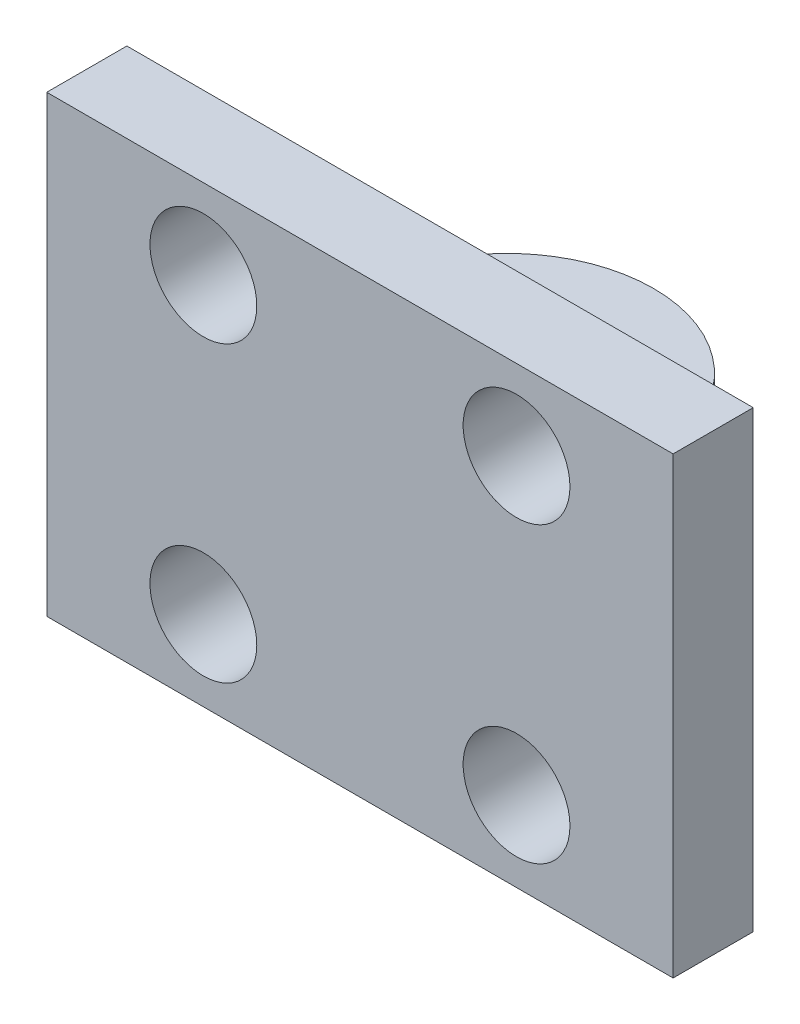
ISO-10303-21;
HEADER;
FILE_DESCRIPTION(('STEP AP214'),'2;1');
FILE_NAME('part.step','',(''),(''),'','','');
FILE_SCHEMA(('AUTOMOTIVE_DESIGN { 1 0 10303 214 1 1 1 1 }'));
ENDSEC;
DATA;
#1=APPLICATION_CONTEXT('core data for automotive mechanical design processes');
#2=APPLICATION_PROTOCOL_DEFINITION('international standard','automotive_design',2000,#1);
#3=PRODUCT_CONTEXT('',#1,'mechanical');
#4=PRODUCT('Part','Part','',(#3));
#5=PRODUCT_RELATED_PRODUCT_CATEGORY('part','',(#4));
#6=PRODUCT_DEFINITION_FORMATION('','',#4);
#7=PRODUCT_DEFINITION_CONTEXT('part definition',#1,'design');
#8=PRODUCT_DEFINITION('design','',#6,#7);
#9=PRODUCT_DEFINITION_SHAPE('','',#8);
#10=(LENGTH_UNIT() NAMED_UNIT(*) SI_UNIT(.MILLI.,.METRE.));
#11=(NAMED_UNIT(*) PLANE_ANGLE_UNIT() SI_UNIT($,.RADIAN.));
#12=(NAMED_UNIT(*) SI_UNIT($,.STERADIAN.) SOLID_ANGLE_UNIT());
#13=UNCERTAINTY_MEASURE_WITH_UNIT(LENGTH_MEASURE(1.E-05),#10,'distance_accuracy_value','');
#14=(GEOMETRIC_REPRESENTATION_CONTEXT(3) GLOBAL_UNCERTAINTY_ASSIGNED_CONTEXT((#13)) GLOBAL_UNIT_ASSIGNED_CONTEXT((#10,
#11,#12)) REPRESENTATION_CONTEXT('',''));
#15=CARTESIAN_POINT('',(0.,0.,0.));
#16=DIRECTION('',(0.,0.,1.));
#17=DIRECTION('',(1.,0.,0.));
#18=AXIS2_PLACEMENT_3D('',#15,#16,#17);
#19=CARTESIAN_POINT('',(0.,0.,0.));
#20=DIRECTION('',(0.,1.,0.));
#21=DIRECTION('',(0.,0.,1.));
#22=AXIS2_PLACEMENT_3D('',#19,#20,#21);
#23=PLANE('',#22);
#24=DIRECTION('',(1.,0.,0.));
#25=VECTOR('',#24,1.);
#26=CARTESIAN_POINT('',(0.,0.,2.5));
#27=LINE('',#26,#25);
#28=CARTESIAN_POINT('',(-11.7296580224804,0.,2.5));
#29=VERTEX_POINT('',#28);
#30=CARTESIAN_POINT('',(0.,0.,2.5));
#31=VERTEX_POINT('',#30);
#32=EDGE_CURVE('E57',#29,#31,#27,.T.);
#33=ORIENTED_EDGE('',*,*,#32,.F.);
#34=DIRECTION('',(-0.928058112611573,0.,0.372435416704488));
#35=VECTOR('',#34,1.);
#36=CARTESIAN_POINT('',(-0.762894767887149,0.,-1.90102940443059));
#37=LINE('',#36,#35);
#38=CARTESIAN_POINT('',(-5.5,0.,0.));
#39=VERTEX_POINT('',#38);
#40=EDGE_CURVE('E215',#39,#29,#37,.T.);
#41=ORIENTED_EDGE('',*,*,#40,.F.);
#42=CARTESIAN_POINT('',(0.,0.,0.));
#43=DIRECTION('',(0.,1.,0.));
#44=DIRECTION('',(0.,0.,1.));
#45=AXIS2_PLACEMENT_3D('',#42,#43,#44);
#46=CIRCLE('',#45,5.5);
#47=CARTESIAN_POINT('',(5.5,0.,0.));
#48=VERTEX_POINT('',#47);
#49=EDGE_CURVE('E236',#48,#39,#46,.T.);
#50=ORIENTED_EDGE('',*,*,#49,.F.);
#51=DIRECTION('',(0.928058112611573,0.,0.372435416704487));
#52=VECTOR('',#51,1.);
#53=CARTESIAN_POINT('',(0.762894767887148,0.,-1.90102940443059));
#54=LINE('',#53,#52);
#55=CARTESIAN_POINT('',(11.7296580224804,0.,2.5));
#56=VERTEX_POINT('',#55);
#57=EDGE_CURVE('E233',#48,#56,#54,.T.);
#58=ORIENTED_EDGE('',*,*,#57,.T.);
#59=EDGE_CURVE('E11',#31,#56,#27,.T.);
#60=ORIENTED_EDGE('',*,*,#59,.F.);
#61=CARTESIAN_POINT('',(0.,0.,0.));
#62=DIRECTION('',(0.,1.,0.));
#63=DIRECTION('',(0.,0.,1.));
#64=AXIS2_PLACEMENT_3D('',#61,#62,#63);
#65=CIRCLE('',#64,2.5);
#66=EDGE_CURVE('E220',#31,#31,#65,.T.);
#67=ORIENTED_EDGE('',*,*,#66,.T.);
#68=EDGE_LOOP('',(#33,#41,#50,#58,#60,#67));
#69=FACE_BOUND('',#68,.T.);
#70=ADVANCED_FACE('F45',(#69),#23,.F.);
#71=CARTESIAN_POINT('',(0.,5.,5.5));
#72=DIRECTION('',(0.,0.,-1.));
#73=DIRECTION('',(-1.,0.,0.));
#74=AXIS2_PLACEMENT_3D('',#71,#72,#73);
#75=PLANE('',#74);
#76=DIRECTION('',(0.,-1.,0.));
#77=VECTOR('',#76,1.);
#78=CARTESIAN_POINT('',(-11.7296580224804,5.,5.5));
#79=LINE('',#78,#77);
#80=CARTESIAN_POINT('',(-11.7296580224804,11.,5.5));
#81=VERTEX_POINT('',#80);
#82=CARTESIAN_POINT('',(-11.7296580224804,-6.,5.5));
#83=VERTEX_POINT('',#82);
#84=EDGE_CURVE('E212',#81,#83,#79,.T.);
#85=ORIENTED_EDGE('',*,*,#84,.T.);
#86=DIRECTION('',(1.,0.,0.));
#87=VECTOR('',#86,1.);
#88=CARTESIAN_POINT('',(0.,-6.,5.5));
#89=LINE('',#88,#87);
#90=CARTESIAN_POINT('',(11.7296580224804,-6.,5.5));
#91=VERTEX_POINT('',#90);
#92=EDGE_CURVE('E126',#83,#91,#89,.T.);
#93=ORIENTED_EDGE('',*,*,#92,.T.);
#94=DIRECTION('',(0.,1.,0.));
#95=VECTOR('',#94,1.);
#96=CARTESIAN_POINT('',(11.7296580224804,5.,5.49999999999999));
#97=LINE('',#96,#95);
#98=CARTESIAN_POINT('',(11.7296580224804,11.,5.5));
#99=VERTEX_POINT('',#98);
#100=EDGE_CURVE('E206',#91,#99,#97,.T.);
#101=ORIENTED_EDGE('',*,*,#100,.T.);
#102=DIRECTION('',(1.,0.,0.));
#103=VECTOR('',#102,1.);
#104=CARTESIAN_POINT('',(0.,11.,5.5));
#105=LINE('',#104,#103);
#106=EDGE_CURVE('E195',#81,#99,#105,.T.);
#107=ORIENTED_EDGE('',*,*,#106,.F.);
#108=EDGE_LOOP('',(#85,#93,#101,#107));
#109=FACE_BOUND('',#108,.T.);
#110=CARTESIAN_POINT('',(-5.86482901124019,8.,5.5));
#111=DIRECTION('',(0.,0.,1.));
#112=DIRECTION('',(1.,0.,0.));
#113=AXIS2_PLACEMENT_3D('',#110,#111,#112);
#114=CIRCLE('',#113,2.);
#115=CARTESIAN_POINT('',(-3.86482901124019,8.,5.5));
#116=VERTEX_POINT('',#115);
#117=EDGE_CURVE('E166',#116,#116,#114,.T.);
#118=ORIENTED_EDGE('',*,*,#117,.F.);
#119=EDGE_LOOP('',(#118));
#120=FACE_BOUND('',#119,.T.);
#121=CARTESIAN_POINT('',(5.86482901124019,8.,5.5));
#122=DIRECTION('',(0.,0.,1.));
#123=DIRECTION('',(1.,0.,0.));
#124=AXIS2_PLACEMENT_3D('',#121,#122,#123);
#125=CIRCLE('',#124,2.);
#126=CARTESIAN_POINT('',(7.86482901124019,8.,5.5));
#127=VERTEX_POINT('',#126);
#128=EDGE_CURVE('E173',#127,#127,#125,.F.);
#129=ORIENTED_EDGE('',*,*,#128,.T.);
#130=EDGE_LOOP('',(#129));
#131=FACE_BOUND('',#130,.T.);
#132=CARTESIAN_POINT('',(-5.86482901124019,-3.,5.5));
#133=DIRECTION('',(0.,0.,1.));
#134=DIRECTION('',(1.,0.,0.));
#135=AXIS2_PLACEMENT_3D('',#132,#133,#134);
#136=CIRCLE('',#135,2.);
#137=CARTESIAN_POINT('',(-3.86482901124019,-3.,5.5));
#138=VERTEX_POINT('',#137);
#139=EDGE_CURVE('E154',#138,#138,#136,.F.);
#140=ORIENTED_EDGE('',*,*,#139,.T.);
#141=EDGE_LOOP('',(#140));
#142=FACE_BOUND('',#141,.T.);
#143=CARTESIAN_POINT('',(5.86482901124019,-3.,5.5));
#144=DIRECTION('',(0.,0.,1.));
#145=DIRECTION('',(1.,0.,0.));
#146=AXIS2_PLACEMENT_3D('',#143,#144,#145);
#147=CIRCLE('',#146,2.);
#148=CARTESIAN_POINT('',(7.86482901124019,-3.,5.5));
#149=VERTEX_POINT('',#148);
#150=EDGE_CURVE('E158',#149,#149,#147,.T.);
#151=ORIENTED_EDGE('',*,*,#150,.F.);
#152=EDGE_LOOP('',(#151));
#153=FACE_BOUND('',#152,.T.);
#154=ADVANCED_FACE('F290',(#109,#120,#131,#142,#153),#75,.F.);
#155=CARTESIAN_POINT('',(0.,5.,0.));
#156=DIRECTION('',(0.,1.,0.));
#157=DIRECTION('',(0.,0.,1.));
#158=AXIS2_PLACEMENT_3D('',#155,#156,#157);
#159=PLANE('',#158);
#160=DIRECTION('',(-1.,0.,0.));
#161=VECTOR('',#160,1.);
#162=CARTESIAN_POINT('',(0.,5.,2.5));
#163=LINE('',#162,#161);
#164=CARTESIAN_POINT('',(11.7296580224804,5.,2.5));
#165=VERTEX_POINT('',#164);
#166=CARTESIAN_POINT('',(0.,5.,2.5));
#167=VERTEX_POINT('',#166);
#168=EDGE_CURVE('E172',#165,#167,#163,.T.);
#169=ORIENTED_EDGE('',*,*,#168,.F.);
#170=DIRECTION('',(0.928058112611573,0.,0.372435416704487));
#171=VECTOR('',#170,1.);
#172=CARTESIAN_POINT('',(0.762894767887148,5.,-1.90102940443059));
#173=LINE('',#172,#171);
#174=CARTESIAN_POINT('',(5.5,5.,0.));
#175=VERTEX_POINT('',#174);
#176=EDGE_CURVE('E219',#175,#165,#173,.T.);
#177=ORIENTED_EDGE('',*,*,#176,.F.);
#178=CARTESIAN_POINT('',(0.,5.,0.));
#179=DIRECTION('',(0.,1.,0.));
#180=DIRECTION('',(0.,0.,1.));
#181=AXIS2_PLACEMENT_3D('',#178,#179,#180);
#182=CIRCLE('',#181,5.5);
#183=CARTESIAN_POINT('',(-5.5,5.,0.));
#184=VERTEX_POINT('',#183);
#185=EDGE_CURVE('E224',#175,#184,#182,.T.);
#186=ORIENTED_EDGE('',*,*,#185,.T.);
#187=DIRECTION('',(-0.928058112611573,0.,0.372435416704488));
#188=VECTOR('',#187,1.);
#189=CARTESIAN_POINT('',(-0.762894767887149,5.,-1.90102940443059));
#190=LINE('',#189,#188);
#191=CARTESIAN_POINT('',(-11.7296580224804,5.,2.5));
#192=VERTEX_POINT('',#191);
#193=EDGE_CURVE('E216',#184,#192,#190,.T.);
#194=ORIENTED_EDGE('',*,*,#193,.T.);
#195=EDGE_CURVE('E55',#167,#192,#163,.T.);
#196=ORIENTED_EDGE('',*,*,#195,.F.);
#197=CARTESIAN_POINT('',(0.,5.,0.));
#198=DIRECTION('',(0.,1.,0.));
#199=DIRECTION('',(0.,0.,1.));
#200=AXIS2_PLACEMENT_3D('',#197,#198,#199);
#201=CIRCLE('',#200,2.5);
#202=EDGE_CURVE('E227',#167,#167,#201,.T.);
#203=ORIENTED_EDGE('',*,*,#202,.F.);
#204=EDGE_LOOP('',(#169,#177,#186,#194,#196,#203));
#205=FACE_BOUND('',#204,.T.);
#206=ADVANCED_FACE('F269',(#205),#159,.T.);
#207=CARTESIAN_POINT('',(-0.762894767887149,5.,-1.90102940443059));
#208=DIRECTION('',(0.372435416704488,0.,0.928058112611573));
#209=DIRECTION('',(0.928058112611573,0.,-0.372435416704488));
#210=AXIS2_PLACEMENT_3D('',#207,#208,#209);
#211=PLANE('',#210);
#212=ORIENTED_EDGE('',*,*,#40,.T.);
#213=DIRECTION('',(0.,-1.,0.));
#214=VECTOR('',#213,1.);
#215=CARTESIAN_POINT('',(-11.7296580224804,5.,2.5));
#216=LINE('',#215,#214);
#217=EDGE_CURVE('E49',#192,#29,#216,.T.);
#218=ORIENTED_EDGE('',*,*,#217,.F.);
#219=ORIENTED_EDGE('',*,*,#193,.F.);
#220=DIRECTION('',(0.,-1.,0.));
#221=VECTOR('',#220,1.);
#222=CARTESIAN_POINT('',(-5.5,5.,0.));
#223=LINE('',#222,#221);
#224=EDGE_CURVE('E230',#184,#39,#223,.T.);
#225=ORIENTED_EDGE('',*,*,#224,.T.);
#226=EDGE_LOOP('',(#212,#218,#219,#225));
#227=FACE_BOUND('',#226,.T.);
#228=ADVANCED_FACE('F47',(#227),#211,.F.);
#229=CARTESIAN_POINT('',(0.762894767887148,5.,-1.90102940443059));
#230=DIRECTION('',(0.372435416704487,0.,-0.928058112611573));
#231=DIRECTION('',(-0.928058112611573,0.,-0.372435416704487));
#232=AXIS2_PLACEMENT_3D('',#229,#230,#231);
#233=PLANE('',#232);
#234=ORIENTED_EDGE('',*,*,#57,.F.);
#235=DIRECTION('',(0.,-1.,0.));
#236=VECTOR('',#235,1.);
#237=CARTESIAN_POINT('',(5.5,5.,0.));
#238=LINE('',#237,#236);
#239=EDGE_CURVE('E244',#175,#48,#238,.T.);
#240=ORIENTED_EDGE('',*,*,#239,.F.);
#241=ORIENTED_EDGE('',*,*,#176,.T.);
#242=DIRECTION('',(0.,-1.,0.));
#243=VECTOR('',#242,1.);
#244=CARTESIAN_POINT('',(11.7296580224804,5.,2.5));
#245=LINE('',#244,#243);
#246=EDGE_CURVE('E246',#165,#56,#245,.T.);
#247=ORIENTED_EDGE('',*,*,#246,.T.);
#248=EDGE_LOOP('',(#234,#240,#241,#247));
#249=FACE_BOUND('',#248,.T.);
#250=ADVANCED_FACE('F267',(#249),#233,.T.);
#251=CARTESIAN_POINT('',(0.,5.,0.));
#252=DIRECTION('',(0.,-1.,0.));
#253=DIRECTION('',(0.,0.,-1.));
#254=AXIS2_PLACEMENT_3D('',#251,#252,#253);
#255=CYLINDRICAL_SURFACE('',#254,5.5);
#256=ORIENTED_EDGE('',*,*,#49,.T.);
#257=ORIENTED_EDGE('',*,*,#224,.F.);
#258=ORIENTED_EDGE('',*,*,#185,.F.);
#259=ORIENTED_EDGE('',*,*,#239,.T.);
#260=EDGE_LOOP('',(#256,#257,#258,#259));
#261=FACE_BOUND('',#260,.T.);
#262=ADVANCED_FACE('F275',(#261),#255,.T.);
#263=CARTESIAN_POINT('',(0.,5.,0.));
#264=DIRECTION('',(0.,-1.,0.));
#265=DIRECTION('',(0.,0.,-1.));
#266=AXIS2_PLACEMENT_3D('',#263,#264,#265);
#267=CYLINDRICAL_SURFACE('',#266,2.5);
#268=ORIENTED_EDGE('',*,*,#202,.T.);
#269=EDGE_LOOP('',(#268));
#270=FACE_BOUND('',#269,.T.);
#271=ORIENTED_EDGE('',*,*,#66,.F.);
#272=EDGE_LOOP('',(#271));
#273=FACE_BOUND('',#272,.T.);
#274=ADVANCED_FACE('F272',(#270,#273),#267,.F.);
#275=CARTESIAN_POINT('',(11.7296580224804,0.,7.5));
#276=DIRECTION('',(-1.,0.,0.));
#277=DIRECTION('',(0.,0.,1.));
#278=AXIS2_PLACEMENT_3D('',#275,#276,#277);
#279=PLANE('',#278);
#280=ORIENTED_EDGE('',*,*,#100,.F.);
#281=DIRECTION('',(0.,0.,1.));
#282=VECTOR('',#281,1.);
#283=CARTESIAN_POINT('',(11.7296580224804,-6.,2.5));
#284=LINE('',#283,#282);
#285=CARTESIAN_POINT('',(11.7296580224804,-6.,2.5));
#286=VERTEX_POINT('',#285);
#287=EDGE_CURVE('E130',#286,#91,#284,.T.);
#288=ORIENTED_EDGE('',*,*,#287,.F.);
#289=DIRECTION('',(0.,-1.,0.));
#290=VECTOR('',#289,1.);
#291=CARTESIAN_POINT('',(11.7296580224804,0.,2.5));
#292=LINE('',#291,#290);
#293=EDGE_CURVE('E131',#56,#286,#292,.T.);
#294=ORIENTED_EDGE('',*,*,#293,.F.);
#295=ORIENTED_EDGE('',*,*,#246,.F.);
#296=DIRECTION('',(0.,1.,0.));
#297=VECTOR('',#296,1.);
#298=CARTESIAN_POINT('',(11.7296580224804,0.,2.5));
#299=LINE('',#298,#297);
#300=CARTESIAN_POINT('',(11.7296580224804,11.,2.5));
#301=VERTEX_POINT('',#300);
#302=EDGE_CURVE('E177',#165,#301,#299,.T.);
#303=ORIENTED_EDGE('',*,*,#302,.T.);
#304=DIRECTION('',(0.,0.,1.));
#305=VECTOR('',#304,1.);
#306=CARTESIAN_POINT('',(11.7296580224804,11.,2.5));
#307=LINE('',#306,#305);
#308=EDGE_CURVE('E191',#301,#99,#307,.T.);
#309=ORIENTED_EDGE('',*,*,#308,.T.);
#310=EDGE_LOOP('',(#280,#288,#294,#295,#303,#309));
#311=FACE_BOUND('',#310,.T.);
#312=ADVANCED_FACE('F265',(#311),#279,.F.);
#313=CARTESIAN_POINT('',(-11.7296580224804,5.,7.5));
#314=DIRECTION('',(1.,0.,0.));
#315=DIRECTION('',(0.,0.,-1.));
#316=AXIS2_PLACEMENT_3D('',#313,#314,#315);
#317=PLANE('',#316);
#318=ORIENTED_EDGE('',*,*,#84,.F.);
#319=DIRECTION('',(0.,0.,1.));
#320=VECTOR('',#319,1.);
#321=CARTESIAN_POINT('',(-11.7296580224804,11.,2.5));
#322=LINE('',#321,#320);
#323=CARTESIAN_POINT('',(-11.7296580224804,11.,2.5));
#324=VERTEX_POINT('',#323);
#325=EDGE_CURVE('E202',#324,#81,#322,.T.);
#326=ORIENTED_EDGE('',*,*,#325,.F.);
#327=DIRECTION('',(0.,1.,0.));
#328=VECTOR('',#327,1.);
#329=CARTESIAN_POINT('',(-11.7296580224804,0.,2.5));
#330=LINE('',#329,#328);
#331=EDGE_CURVE('E184',#192,#324,#330,.T.);
#332=ORIENTED_EDGE('',*,*,#331,.F.);
#333=ORIENTED_EDGE('',*,*,#217,.T.);
#334=DIRECTION('',(0.,-1.,0.));
#335=VECTOR('',#334,1.);
#336=CARTESIAN_POINT('',(-11.7296580224804,0.,2.5));
#337=LINE('',#336,#335);
#338=CARTESIAN_POINT('',(-11.7296580224804,-6.,2.5));
#339=VERTEX_POINT('',#338);
#340=EDGE_CURVE('E137',#29,#339,#337,.T.);
#341=ORIENTED_EDGE('',*,*,#340,.T.);
#342=DIRECTION('',(0.,0.,1.));
#343=VECTOR('',#342,1.);
#344=CARTESIAN_POINT('',(-11.7296580224804,-6.,2.5));
#345=LINE('',#344,#343);
#346=EDGE_CURVE('E120',#339,#83,#345,.T.);
#347=ORIENTED_EDGE('',*,*,#346,.T.);
#348=EDGE_LOOP('',(#318,#326,#332,#333,#341,#347));
#349=FACE_BOUND('',#348,.T.);
#350=ADVANCED_FACE('F143',(#349),#317,.F.);
#351=CARTESIAN_POINT('',(0.,11.,2.5));
#352=DIRECTION('',(0.,-1.,0.));
#353=DIRECTION('',(1.,0.,0.));
#354=AXIS2_PLACEMENT_3D('',#351,#352,#353);
#355=PLANE('',#354);
#356=ORIENTED_EDGE('',*,*,#106,.T.);
#357=ORIENTED_EDGE('',*,*,#308,.F.);
#358=DIRECTION('',(1.,0.,0.));
#359=VECTOR('',#358,1.);
#360=CARTESIAN_POINT('',(0.,11.,2.5));
#361=LINE('',#360,#359);
#362=EDGE_CURVE('E181',#324,#301,#361,.T.);
#363=ORIENTED_EDGE('',*,*,#362,.F.);
#364=ORIENTED_EDGE('',*,*,#325,.T.);
#365=EDGE_LOOP('',(#356,#357,#363,#364));
#366=FACE_BOUND('',#365,.T.);
#367=ADVANCED_FACE('F263',(#366),#355,.F.);
#368=CARTESIAN_POINT('',(-5.86482901124019,8.,2.5));
#369=DIRECTION('',(0.,0.,1.));
#370=DIRECTION('',(1.,0.,0.));
#371=AXIS2_PLACEMENT_3D('',#368,#369,#370);
#372=CYLINDRICAL_SURFACE('',#371,2.);
#373=CARTESIAN_POINT('',(-5.86482901124019,8.,2.5));
#374=DIRECTION('',(0.,0.,1.));
#375=DIRECTION('',(1.,0.,0.));
#376=AXIS2_PLACEMENT_3D('',#373,#374,#375);
#377=CIRCLE('',#376,2.);
#378=CARTESIAN_POINT('',(-3.86482901124019,8.,2.5));
#379=VERTEX_POINT('',#378);
#380=EDGE_CURVE('E168',#379,#379,#377,.T.);
#381=ORIENTED_EDGE('',*,*,#380,.F.);
#382=EDGE_LOOP('',(#381));
#383=FACE_BOUND('',#382,.T.);
#384=ORIENTED_EDGE('',*,*,#117,.T.);
#385=EDGE_LOOP('',(#384));
#386=FACE_BOUND('',#385,.T.);
#387=ADVANCED_FACE('F303',(#383,#386),#372,.F.);
#388=CARTESIAN_POINT('',(5.86482901124019,8.,2.5));
#389=DIRECTION('',(0.,0.,1.));
#390=DIRECTION('',(1.,0.,0.));
#391=AXIS2_PLACEMENT_3D('',#388,#389,#390);
#392=CYLINDRICAL_SURFACE('',#391,2.);
#393=CARTESIAN_POINT('',(5.86482901124019,8.,2.5));
#394=DIRECTION('',(0.,0.,1.));
#395=DIRECTION('',(1.,0.,0.));
#396=AXIS2_PLACEMENT_3D('',#393,#394,#395);
#397=CIRCLE('',#396,2.);
#398=CARTESIAN_POINT('',(7.86482901124019,8.,2.5));
#399=VERTEX_POINT('',#398);
#400=EDGE_CURVE('E187',#399,#399,#397,.F.);
#401=ORIENTED_EDGE('',*,*,#400,.T.);
#402=EDGE_LOOP('',(#401));
#403=FACE_BOUND('',#402,.T.);
#404=ORIENTED_EDGE('',*,*,#128,.F.);
#405=EDGE_LOOP('',(#404));
#406=FACE_BOUND('',#405,.T.);
#407=ADVANCED_FACE('F306',(#403,#406),#392,.F.);
#408=CARTESIAN_POINT('',(0.,0.,2.5));
#409=DIRECTION('',(0.,0.,1.));
#410=DIRECTION('',(1.,0.,0.));
#411=AXIS2_PLACEMENT_3D('',#408,#409,#410);
#412=PLANE('',#411);
#413=ORIENTED_EDGE('',*,*,#380,.T.);
#414=EDGE_LOOP('',(#413));
#415=FACE_BOUND('',#414,.T.);
#416=ORIENTED_EDGE('',*,*,#168,.T.);
#417=ORIENTED_EDGE('',*,*,#195,.T.);
#418=ORIENTED_EDGE('',*,*,#331,.T.);
#419=ORIENTED_EDGE('',*,*,#362,.T.);
#420=ORIENTED_EDGE('',*,*,#302,.F.);
#421=EDGE_LOOP('',(#416,#417,#418,#419,#420));
#422=FACE_BOUND('',#421,.T.);
#423=ORIENTED_EDGE('',*,*,#400,.F.);
#424=EDGE_LOOP('',(#423));
#425=FACE_BOUND('',#424,.T.);
#426=ADVANCED_FACE('F255',(#415,#422,#425),#412,.F.);
#427=CARTESIAN_POINT('',(0.,-6.,2.5));
#428=DIRECTION('',(0.,-1.,0.));
#429=DIRECTION('',(1.,0.,0.));
#430=AXIS2_PLACEMENT_3D('',#427,#428,#429);
#431=PLANE('',#430);
#432=ORIENTED_EDGE('',*,*,#92,.F.);
#433=ORIENTED_EDGE('',*,*,#346,.F.);
#434=DIRECTION('',(1.,0.,0.));
#435=VECTOR('',#434,1.);
#436=CARTESIAN_POINT('',(0.,-6.,2.5));
#437=LINE('',#436,#435);
#438=EDGE_CURVE('E124',#339,#286,#437,.T.);
#439=ORIENTED_EDGE('',*,*,#438,.T.);
#440=ORIENTED_EDGE('',*,*,#287,.T.);
#441=EDGE_LOOP('',(#432,#433,#439,#440));
#442=FACE_BOUND('',#441,.T.);
#443=ADVANCED_FACE('F122',(#442),#431,.T.);
#444=CARTESIAN_POINT('',(5.86482901124019,-3.,2.5));
#445=DIRECTION('',(0.,0.,1.));
#446=DIRECTION('',(1.,0.,0.));
#447=AXIS2_PLACEMENT_3D('',#444,#445,#446);
#448=CYLINDRICAL_SURFACE('',#447,2.);
#449=CARTESIAN_POINT('',(5.86482901124019,-3.,2.5));
#450=DIRECTION('',(0.,0.,1.));
#451=DIRECTION('',(1.,0.,0.));
#452=AXIS2_PLACEMENT_3D('',#449,#450,#451);
#453=CIRCLE('',#452,2.);
#454=CARTESIAN_POINT('',(7.86482901124019,-3.,2.5));
#455=VERTEX_POINT('',#454);
#456=EDGE_CURVE('E149',#455,#455,#453,.T.);
#457=ORIENTED_EDGE('',*,*,#456,.F.);
#458=EDGE_LOOP('',(#457));
#459=FACE_BOUND('',#458,.T.);
#460=ORIENTED_EDGE('',*,*,#150,.T.);
#461=EDGE_LOOP('',(#460));
#462=FACE_BOUND('',#461,.T.);
#463=ADVANCED_FACE('F319',(#459,#462),#448,.F.);
#464=CARTESIAN_POINT('',(-5.86482901124019,-3.,2.5));
#465=DIRECTION('',(0.,0.,1.));
#466=DIRECTION('',(1.,0.,0.));
#467=AXIS2_PLACEMENT_3D('',#464,#465,#466);
#468=CYLINDRICAL_SURFACE('',#467,2.);
#469=CARTESIAN_POINT('',(-5.86482901124019,-3.,2.5));
#470=DIRECTION('',(0.,0.,1.));
#471=DIRECTION('',(1.,0.,0.));
#472=AXIS2_PLACEMENT_3D('',#469,#470,#471);
#473=CIRCLE('',#472,2.);
#474=CARTESIAN_POINT('',(-3.86482901124019,-3.,2.5));
#475=VERTEX_POINT('',#474);
#476=EDGE_CURVE('E164',#475,#475,#473,.F.);
#477=ORIENTED_EDGE('',*,*,#476,.T.);
#478=EDGE_LOOP('',(#477));
#479=FACE_BOUND('',#478,.T.);
#480=ORIENTED_EDGE('',*,*,#139,.F.);
#481=EDGE_LOOP('',(#480));
#482=FACE_BOUND('',#481,.T.);
#483=ADVANCED_FACE('F316',(#479,#482),#468,.F.);
#484=CARTESIAN_POINT('',(0.,0.,2.5));
#485=DIRECTION('',(0.,0.,1.));
#486=DIRECTION('',(1.,0.,0.));
#487=AXIS2_PLACEMENT_3D('',#484,#485,#486);
#488=PLANE('',#487);
#489=ORIENTED_EDGE('',*,*,#476,.F.);
#490=EDGE_LOOP('',(#489));
#491=FACE_BOUND('',#490,.T.);
#492=ORIENTED_EDGE('',*,*,#456,.T.);
#493=EDGE_LOOP('',(#492));
#494=FACE_BOUND('',#493,.T.);
#495=ORIENTED_EDGE('',*,*,#32,.T.);
#496=ORIENTED_EDGE('',*,*,#59,.T.);
#497=ORIENTED_EDGE('',*,*,#293,.T.);
#498=ORIENTED_EDGE('',*,*,#438,.F.);
#499=ORIENTED_EDGE('',*,*,#340,.F.);
#500=EDGE_LOOP('',(#495,#496,#497,#498,#499));
#501=FACE_BOUND('',#500,.T.);
#502=ADVANCED_FACE('F136',(#491,#494,#501),#488,.F.);
#503=CLOSED_SHELL('',(#70,#154,#206,#228,#250,#262,#274,#312,#350,#367,#387,#407,#426,#443,#463,
#483,#502));
#504=MANIFOLD_SOLID_BREP('B2',#503);
#505=ADVANCED_BREP_SHAPE_REPRESENTATION('',(#18,#504),#14);
#506=SHAPE_DEFINITION_REPRESENTATION(#9,#505);
ENDSEC;
END-ISO-10303-21;
